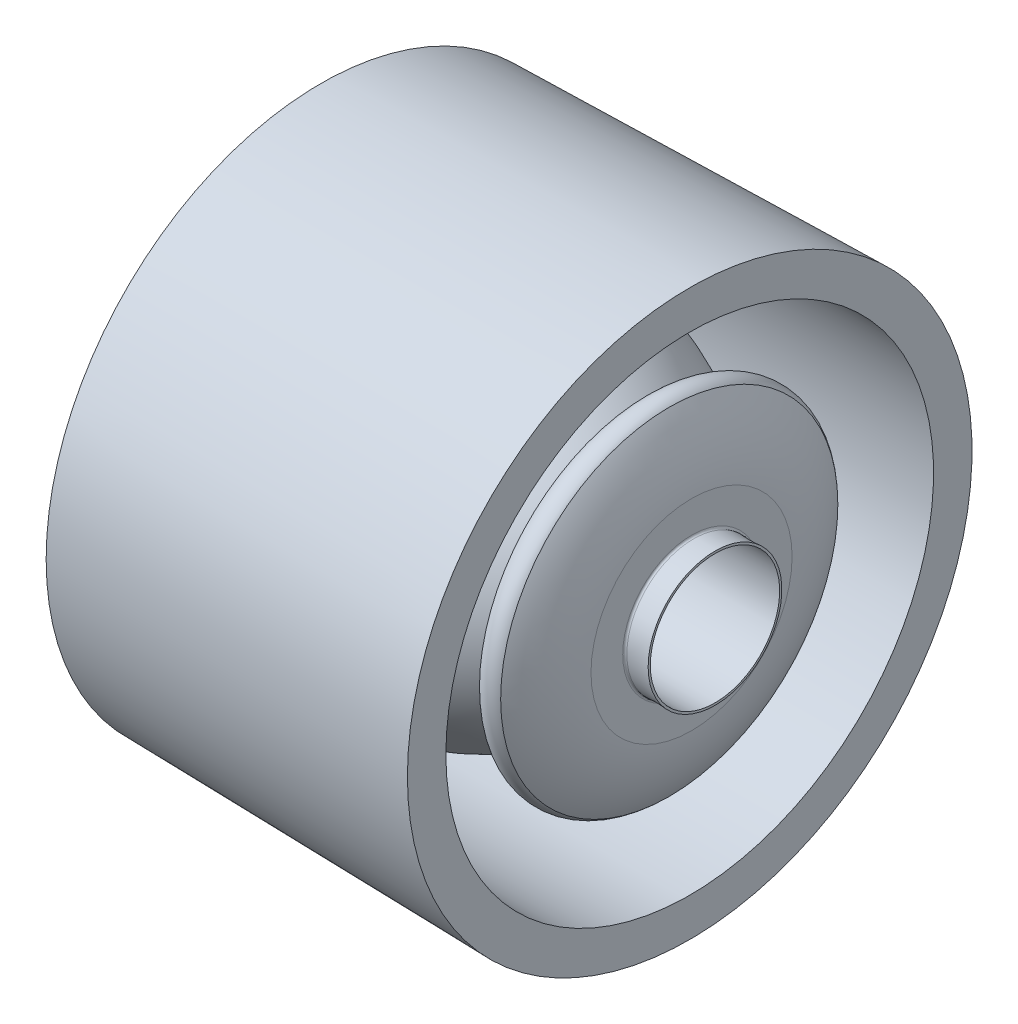
ISO-10303-21;
HEADER;
FILE_DESCRIPTION(('STEP AP214'),'2;1');
FILE_NAME('part.step','',(''),(''),'','','');
FILE_SCHEMA(('AUTOMOTIVE_DESIGN { 1 0 10303 214 1 1 1 1 }'));
ENDSEC;
DATA;
#1=APPLICATION_CONTEXT('core data for automotive mechanical design processes');
#2=APPLICATION_PROTOCOL_DEFINITION('international standard','automotive_design',2000,#1);
#3=PRODUCT_CONTEXT('',#1,'mechanical');
#4=PRODUCT('Part','Part','',(#3));
#5=PRODUCT_RELATED_PRODUCT_CATEGORY('part','',(#4));
#6=PRODUCT_DEFINITION_FORMATION('','',#4);
#7=PRODUCT_DEFINITION_CONTEXT('part definition',#1,'design');
#8=PRODUCT_DEFINITION('design','',#6,#7);
#9=PRODUCT_DEFINITION_SHAPE('','',#8);
#10=(LENGTH_UNIT() NAMED_UNIT(*) SI_UNIT(.MILLI.,.METRE.));
#11=(NAMED_UNIT(*) PLANE_ANGLE_UNIT() SI_UNIT($,.RADIAN.));
#12=(NAMED_UNIT(*) SI_UNIT($,.STERADIAN.) SOLID_ANGLE_UNIT());
#13=UNCERTAINTY_MEASURE_WITH_UNIT(LENGTH_MEASURE(1.E-05),#10,'distance_accuracy_value','');
#14=(GEOMETRIC_REPRESENTATION_CONTEXT(3) GLOBAL_UNCERTAINTY_ASSIGNED_CONTEXT((#13)) GLOBAL_UNIT_ASSIGNED_CONTEXT((#10,
#11,#12)) REPRESENTATION_CONTEXT('',''));
#15=CARTESIAN_POINT('',(0.,0.,0.));
#16=DIRECTION('',(0.,0.,1.));
#17=DIRECTION('',(1.,0.,0.));
#18=AXIS2_PLACEMENT_3D('',#15,#16,#17);
#19=CARTESIAN_POINT('',(39.7171570550938,33.1978,0.));
#20=DIRECTION('',(-1.,0.,0.));
#21=DIRECTION('',(0.,0.,1.));
#22=AXIS2_PLACEMENT_3D('',#19,#20,#21);
#23=TOROIDAL_SURFACE('',#22,18.578805481197,1.50796092577745);
#24=CARTESIAN_POINT('',(40.7646609372587,33.1978,0.));
#25=DIRECTION('',(-1.,0.,0.));
#26=DIRECTION('',(0.,0.,1.));
#27=AXIS2_PLACEMENT_3D('',#24,#25,#26);
#28=CIRCLE('',#27,19.6635551161456);
#29=CARTESIAN_POINT('',(40.7646609372587,33.1978,19.6635551161456));
#30=VERTEX_POINT('',#29);
#31=EDGE_CURVE('E109',#30,#30,#28,.T.);
#32=ORIENTED_EDGE('',*,*,#31,.F.);
#33=EDGE_LOOP('',(#32));
#34=FACE_BOUND('',#33,.T.);
#35=CARTESIAN_POINT('',(38.6508676587122,33.1978,0.));
#36=DIRECTION('',(-1.,0.,0.));
#37=DIRECTION('',(0.,0.,1.));
#38=AXIS2_PLACEMENT_3D('',#35,#36,#37);
#39=CIRCLE('',#38,19.6450948775786);
#40=CARTESIAN_POINT('',(38.6508676587122,33.1978,19.6450948775786));
#41=VERTEX_POINT('',#40);
#42=EDGE_CURVE('E10',#41,#41,#39,.T.);
#43=ORIENTED_EDGE('',*,*,#42,.T.);
#44=EDGE_LOOP('',(#43));
#45=FACE_BOUND('',#44,.T.);
#46=ADVANCED_FACE('F30',(#34,#45),#23,.F.);
#47=CARTESIAN_POINT('',(38.6508676587122,33.1978,0.));
#48=DIRECTION('',(-1.,0.,0.));
#49=DIRECTION('',(0.,0.,1.));
#50=AXIS2_PLACEMENT_3D('',#47,#48,#49);
#51=CONICAL_SURFACE('',#50,19.6450948775786,0.785398163397429);
#52=CARTESIAN_POINT('',(38.4712625362909,33.1978,0.));
#53=DIRECTION('',(-1.,0.,0.));
#54=DIRECTION('',(0.,0.,1.));
#55=AXIS2_PLACEMENT_3D('',#52,#53,#54);
#56=CIRCLE('',#55,19.8247);
#57=CARTESIAN_POINT('',(38.4712625362909,33.1978,19.8247));
#58=VERTEX_POINT('',#57);
#59=EDGE_CURVE('E36',#58,#58,#56,.T.);
#60=ORIENTED_EDGE('',*,*,#59,.T.);
#61=EDGE_LOOP('',(#60));
#62=FACE_BOUND('',#61,.T.);
#63=ORIENTED_EDGE('',*,*,#42,.F.);
#64=EDGE_LOOP('',(#63));
#65=FACE_BOUND('',#64,.T.);
#66=ADVANCED_FACE('F117',(#62,#65),#51,.F.);
#67=CARTESIAN_POINT('',(39.7171570550938,33.1978,0.));
#68=DIRECTION('',(-1.,0.,0.));
#69=DIRECTION('',(0.,0.,1.));
#70=AXIS2_PLACEMENT_3D('',#67,#68,#69);
#71=TOROIDAL_SURFACE('',#70,18.578805481197,1.76196092577746);
#72=CARTESIAN_POINT('',(40.9630515738968,33.1978,0.));
#73=DIRECTION('',(-1.,0.,0.));
#74=DIRECTION('',(0.,0.,1.));
#75=AXIS2_PLACEMENT_3D('',#72,#73,#74);
#76=CIRCLE('',#75,19.8247);
#77=CARTESIAN_POINT('',(40.9630515738968,33.1978,19.8247));
#78=VERTEX_POINT('',#77);
#79=EDGE_CURVE('E40',#78,#78,#76,.T.);
#80=ORIENTED_EDGE('',*,*,#79,.T.);
#81=EDGE_LOOP('',(#80));
#82=FACE_BOUND('',#81,.T.);
#83=ORIENTED_EDGE('',*,*,#59,.F.);
#84=EDGE_LOOP('',(#83));
#85=FACE_BOUND('',#84,.T.);
#86=ADVANCED_FACE('F121',(#82,#85),#71,.T.);
#87=CARTESIAN_POINT('',(26.9169481191962,33.1978,0.));
#88=DIRECTION('',(-1.,0.,0.));
#89=DIRECTION('',(0.,0.,1.));
#90=AXIS2_PLACEMENT_3D('',#87,#88,#89);
#91=DEGENERATE_TOROIDAL_SURFACE('',#90,10.7936458645717,16.6988910127945,.T.);
#92=ORIENTED_EDGE('',*,*,#79,.F.);
#93=EDGE_LOOP('',(#92));
#94=FACE_BOUND('',#93,.T.);
#95=CARTESIAN_POINT('',(43.5840399331653,33.1978,0.));
#96=DIRECTION('',(-1.,0.,0.));
#97=DIRECTION('',(0.,0.,1.));
#98=AXIS2_PLACEMENT_3D('',#95,#96,#97);
#99=CIRCLE('',#98,11.8237);
#100=CARTESIAN_POINT('',(43.5840399331653,33.1978,11.8237));
#101=VERTEX_POINT('',#100);
#102=EDGE_CURVE('E44',#101,#101,#99,.T.);
#103=ORIENTED_EDGE('',*,*,#102,.T.);
#104=EDGE_LOOP('',(#103));
#105=FACE_BOUND('',#104,.T.);
#106=ADVANCED_FACE('F125',(#94,#105),#91,.T.);
#107=CARTESIAN_POINT('',(43.5840399331653,-40.3923492404086,0.));
#108=DIRECTION('',(-1.,0.,0.));
#109=DIRECTION('',(0.,0.,1.));
#110=AXIS2_PLACEMENT_3D('',#107,#108,#109);
#111=PLANE('',#110);
#112=ORIENTED_EDGE('',*,*,#102,.F.);
#113=EDGE_LOOP('',(#112));
#114=FACE_BOUND('',#113,.T.);
#115=CARTESIAN_POINT('',(43.5840399331653,33.1978,0.));
#116=DIRECTION('',(-1.,0.,0.));
#117=DIRECTION('',(0.,0.,1.));
#118=AXIS2_PLACEMENT_3D('',#115,#116,#117);
#119=CIRCLE('',#118,8.09197569485098);
#120=CARTESIAN_POINT('',(43.5840399331653,33.1978,8.09197569485098));
#121=VERTEX_POINT('',#120);
#122=EDGE_CURVE('E49',#121,#121,#119,.T.);
#123=ORIENTED_EDGE('',*,*,#122,.T.);
#124=EDGE_LOOP('',(#123));
#125=FACE_BOUND('',#124,.T.);
#126=ADVANCED_FACE('F132',(#114,#125),#111,.F.);
#127=CARTESIAN_POINT('',(43.8380399331653,33.1978,0.));
#128=DIRECTION('',(-1.,0.,0.));
#129=DIRECTION('',(0.,0.,1.));
#130=AXIS2_PLACEMENT_3D('',#127,#128,#129);
#131=TOROIDAL_SURFACE('',#130,8.09197569485098,0.253999999999998);
#132=CARTESIAN_POINT('',(43.8158993428024,33.1978,0.));
#133=DIRECTION('',(-1.,0.,0.));
#134=DIRECTION('',(0.,0.,1.));
#135=AXIS2_PLACEMENT_3D('',#132,#133,#134);
#136=CIRCLE('',#135,7.83894250679377);
#137=CARTESIAN_POINT('',(43.8158993428024,33.1978,7.83894250679377));
#138=VERTEX_POINT('',#137);
#139=EDGE_CURVE('E52',#138,#138,#136,.T.);
#140=ORIENTED_EDGE('',*,*,#139,.T.);
#141=EDGE_LOOP('',(#140));
#142=FACE_BOUND('',#141,.T.);
#143=ORIENTED_EDGE('',*,*,#122,.F.);
#144=EDGE_LOOP('',(#143));
#145=FACE_BOUND('',#144,.T.);
#146=ADVANCED_FACE('F136',(#142,#145),#131,.F.);
#147=CARTESIAN_POINT('',(44.9628881535825,33.1978,0.));
#148=DIRECTION('',(-1.,0.,0.));
#149=DIRECTION('',(0.,0.,1.));
#150=AXIS2_PLACEMENT_3D('',#147,#148,#149);
#151=TOROIDAL_SURFACE('',#150,20.9472756949032,13.158418685486);
#152=CARTESIAN_POINT('',(46.3417363739985,33.1978,0.));
#153=DIRECTION('',(-1.,0.,0.));
#154=DIRECTION('',(0.,0.,1.));
#155=AXIS2_PLACEMENT_3D('',#152,#153,#154);
#156=CIRCLE('',#155,7.8612999999998);
#157=CARTESIAN_POINT('',(46.3417363739985,33.1978,7.8612999999998));
#158=VERTEX_POINT('',#157);
#159=EDGE_CURVE('E55',#158,#158,#156,.T.);
#160=ORIENTED_EDGE('',*,*,#159,.T.);
#161=EDGE_LOOP('',(#160));
#162=FACE_BOUND('',#161,.T.);
#163=ORIENTED_EDGE('',*,*,#139,.F.);
#164=EDGE_LOOP('',(#163));
#165=FACE_BOUND('',#164,.T.);
#166=ADVANCED_FACE('F140',(#162,#165),#151,.F.);
#167=CARTESIAN_POINT('',(46.3417363739985,-40.3923492404094,0.));
#168=DIRECTION('',(-1.,0.,0.));
#169=DIRECTION('',(0.,0.,1.));
#170=AXIS2_PLACEMENT_3D('',#167,#168,#169);
#171=PLANE('',#170);
#172=ORIENTED_EDGE('',*,*,#159,.F.);
#173=EDGE_LOOP('',(#172));
#174=FACE_BOUND('',#173,.T.);
#175=CARTESIAN_POINT('',(46.3417363739985,33.1978,0.));
#176=DIRECTION('',(-1.,0.,0.));
#177=DIRECTION('',(0.,0.,1.));
#178=AXIS2_PLACEMENT_3D('',#175,#176,#177);
#179=CIRCLE('',#178,7.6072999999998);
#180=CARTESIAN_POINT('',(46.3417363739985,33.1978,7.6072999999998));
#181=VERTEX_POINT('',#180);
#182=EDGE_CURVE('E58',#181,#181,#179,.T.);
#183=ORIENTED_EDGE('',*,*,#182,.T.);
#184=EDGE_LOOP('',(#183));
#185=FACE_BOUND('',#184,.T.);
#186=ADVANCED_FACE('F144',(#174,#185),#171,.F.);
#187=CARTESIAN_POINT('',(10.414,33.1978,0.));
#188=DIRECTION('',(-1.,0.,0.));
#189=DIRECTION('',(0.,0.,1.));
#190=AXIS2_PLACEMENT_3D('',#187,#188,#189);
#191=CYLINDRICAL_SURFACE('',#190,7.60729999999981);
#192=ORIENTED_EDGE('',*,*,#182,.F.);
#193=EDGE_LOOP('',(#192));
#194=FACE_BOUND('',#193,.T.);
#195=CARTESIAN_POINT('',(34.7847363739985,33.1978,0.));
#196=DIRECTION('',(-1.,0.,0.));
#197=DIRECTION('',(0.,0.,1.));
#198=AXIS2_PLACEMENT_3D('',#195,#196,#197);
#199=CIRCLE('',#198,7.60729999999982);
#200=CARTESIAN_POINT('',(34.7847363739985,33.1978,7.60729999999982));
#201=VERTEX_POINT('',#200);
#202=EDGE_CURVE('E61',#201,#201,#199,.T.);
#203=ORIENTED_EDGE('',*,*,#202,.T.);
#204=EDGE_LOOP('',(#203));
#205=FACE_BOUND('',#204,.T.);
#206=ADVANCED_FACE('F148',(#194,#205),#191,.F.);
#207=CARTESIAN_POINT('',(34.7847363739985,-40.3923492404086,0.));
#208=DIRECTION('',(-1.,0.,0.));
#209=DIRECTION('',(0.,0.,1.));
#210=AXIS2_PLACEMENT_3D('',#207,#208,#209);
#211=PLANE('',#210);
#212=CARTESIAN_POINT('',(34.7847363739985,33.1978,0.));
#213=DIRECTION('',(-1.,0.,0.));
#214=DIRECTION('',(0.,0.,1.));
#215=AXIS2_PLACEMENT_3D('',#212,#213,#214);
#216=CIRCLE('',#215,7.86129999999999);
#217=CARTESIAN_POINT('',(34.7847363739985,33.1978,7.86129999999999));
#218=VERTEX_POINT('',#217);
#219=EDGE_CURVE('E64',#218,#218,#216,.T.);
#220=ORIENTED_EDGE('',*,*,#219,.T.);
#221=EDGE_LOOP('',(#220));
#222=FACE_BOUND('',#221,.T.);
#223=ORIENTED_EDGE('',*,*,#202,.F.);
#224=EDGE_LOOP('',(#223));
#225=FACE_BOUND('',#224,.T.);
#226=ADVANCED_FACE('F152',(#222,#225),#211,.T.);
#227=CARTESIAN_POINT('',(10.414,33.1978,0.));
#228=DIRECTION('',(-1.,0.,0.));
#229=DIRECTION('',(0.,0.,1.));
#230=AXIS2_PLACEMENT_3D('',#227,#228,#229);
#231=CYLINDRICAL_SURFACE('',#230,7.86129999999999);
#232=CARTESIAN_POINT('',(42.8572193305396,33.1978,0.));
#233=DIRECTION('',(-1.,0.,0.));
#234=DIRECTION('',(0.,0.,1.));
#235=AXIS2_PLACEMENT_3D('',#232,#233,#234);
#236=CIRCLE('',#235,7.86129999999999);
#237=CARTESIAN_POINT('',(42.8572193305396,33.1978,7.86129999999999));
#238=VERTEX_POINT('',#237);
#239=EDGE_CURVE('E67',#238,#238,#236,.T.);
#240=ORIENTED_EDGE('',*,*,#239,.T.);
#241=EDGE_LOOP('',(#240));
#242=FACE_BOUND('',#241,.T.);
#243=ORIENTED_EDGE('',*,*,#219,.F.);
#244=EDGE_LOOP('',(#243));
#245=FACE_BOUND('',#244,.T.);
#246=ADVANCED_FACE('F156',(#242,#245),#231,.T.);
#247=CARTESIAN_POINT('',(12.8815266953126,33.1978,0.));
#248=DIRECTION('',(-1.,0.,0.));
#249=DIRECTION('',(0.,0.,1.));
#250=AXIS2_PLACEMENT_3D('',#247,#248,#249);
#251=DEGENERATE_TOROIDAL_SURFACE('',#250,15.2894545867104,37.874788275259,.F.);
#252=ORIENTED_EDGE('',*,*,#239,.F.);
#253=EDGE_LOOP('',(#252));
#254=FACE_BOUND('',#253,.T.);
#255=CARTESIAN_POINT('',(11.3709949650023,33.1978,0.));
#256=DIRECTION('',(-1.,0.,0.));
#257=DIRECTION('',(0.,0.,1.));
#258=AXIS2_PLACEMENT_3D('',#255,#256,#257);
#259=CIRCLE('',#258,22.5552);
#260=CARTESIAN_POINT('',(11.3709949650023,33.1978,22.5552));
#261=VERTEX_POINT('',#260);
#262=EDGE_CURVE('E70',#261,#261,#259,.T.);
#263=ORIENTED_EDGE('',*,*,#262,.T.);
#264=EDGE_LOOP('',(#263));
#265=FACE_BOUND('',#264,.T.);
#266=ADVANCED_FACE('F160',(#254,#265),#251,.T.);
#267=CARTESIAN_POINT('',(10.414,33.1978,0.));
#268=DIRECTION('',(-1.,0.,0.));
#269=DIRECTION('',(0.,0.,1.));
#270=AXIS2_PLACEMENT_3D('',#267,#268,#269);
#271=CYLINDRICAL_SURFACE('',#270,22.5552);
#272=ORIENTED_EDGE('',*,*,#262,.F.);
#273=EDGE_LOOP('',(#272));
#274=FACE_BOUND('',#273,.T.);
#275=CARTESIAN_POINT('',(10.7189529785927,33.1978,0.));
#276=DIRECTION('',(-1.,0.,0.));
#277=DIRECTION('',(0.,0.,1.));
#278=AXIS2_PLACEMENT_3D('',#275,#276,#277);
#279=CIRCLE('',#278,22.5552);
#280=CARTESIAN_POINT('',(10.7189529785927,33.1978,22.5552));
#281=VERTEX_POINT('',#280);
#282=EDGE_CURVE('E73',#281,#281,#279,.T.);
#283=ORIENTED_EDGE('',*,*,#282,.T.);
#284=EDGE_LOOP('',(#283));
#285=FACE_BOUND('',#284,.T.);
#286=ADVANCED_FACE('F164',(#274,#285),#271,.F.);
#287=CARTESIAN_POINT('',(10.7189529785927,-40.3923492404086,0.));
#288=DIRECTION('',(1.,0.,0.));
#289=DIRECTION('',(0.,0.,-1.));
#290=AXIS2_PLACEMENT_3D('',#287,#288,#289);
#291=PLANE('',#290);
#292=ORIENTED_EDGE('',*,*,#282,.F.);
#293=EDGE_LOOP('',(#292));
#294=FACE_BOUND('',#293,.T.);
#295=ADVANCED_FACE('F168',(#294),#291,.T.);
#296=CARTESIAN_POINT('',(10.414,-40.3923492404086,0.));
#297=DIRECTION('',(1.,0.,0.));
#298=DIRECTION('',(0.,0.,-1.));
#299=AXIS2_PLACEMENT_3D('',#296,#297,#298);
#300=PLANE('',#299);
#301=CARTESIAN_POINT('',(10.414,33.1978,0.));
#302=DIRECTION('',(-1.,0.,0.));
#303=DIRECTION('',(0.,0.,1.));
#304=AXIS2_PLACEMENT_3D('',#301,#302,#303);
#305=CIRCLE('',#304,22.8092);
#306=CARTESIAN_POINT('',(10.414,33.1978,22.8092));
#307=VERTEX_POINT('',#306);
#308=EDGE_CURVE('E76',#307,#307,#305,.T.);
#309=ORIENTED_EDGE('',*,*,#308,.T.);
#310=EDGE_LOOP('',(#309));
#311=FACE_BOUND('',#310,.T.);
#312=ADVANCED_FACE('F172',(#311),#300,.F.);
#313=CARTESIAN_POINT('',(0.,33.1978,0.));
#314=DIRECTION('',(-1.,0.,0.));
#315=DIRECTION('',(0.,0.,1.));
#316=AXIS2_PLACEMENT_3D('',#313,#314,#315);
#317=CONICAL_SURFACE('',#316,26.7208,0.35930514376324);
#318=ORIENTED_EDGE('',*,*,#308,.F.);
#319=EDGE_LOOP('',(#318));
#320=FACE_BOUND('',#319,.T.);
#321=CARTESIAN_POINT('',(0.,33.1978,0.));
#322=DIRECTION('',(-1.,0.,0.));
#323=DIRECTION('',(0.,0.,1.));
#324=AXIS2_PLACEMENT_3D('',#321,#322,#323);
#325=CIRCLE('',#324,26.7208);
#326=CARTESIAN_POINT('',(0.,33.1978,26.7208));
#327=VERTEX_POINT('',#326);
#328=EDGE_CURVE('E79',#327,#327,#325,.T.);
#329=ORIENTED_EDGE('',*,*,#328,.T.);
#330=EDGE_LOOP('',(#329));
#331=FACE_BOUND('',#330,.T.);
#332=ADVANCED_FACE('F176',(#320,#331),#317,.F.);
#333=CARTESIAN_POINT('',(0.,-40.3923492404086,0.));
#334=DIRECTION('',(1.,0.,0.));
#335=DIRECTION('',(0.,0.,-1.));
#336=AXIS2_PLACEMENT_3D('',#333,#334,#335);
#337=PLANE('',#336);
#338=ORIENTED_EDGE('',*,*,#328,.F.);
#339=EDGE_LOOP('',(#338));
#340=FACE_BOUND('',#339,.T.);
#341=CARTESIAN_POINT('',(0.,33.1978,0.));
#342=DIRECTION('',(-1.,0.,0.));
#343=DIRECTION('',(0.,0.,1.));
#344=AXIS2_PLACEMENT_3D('',#341,#342,#343);
#345=CIRCLE('',#344,32.3088);
#346=CARTESIAN_POINT('',(0.,33.1978,32.3088));
#347=VERTEX_POINT('',#346);
#348=EDGE_CURVE('E82',#347,#347,#345,.T.);
#349=ORIENTED_EDGE('',*,*,#348,.T.);
#350=EDGE_LOOP('',(#349));
#351=FACE_BOUND('',#350,.T.);
#352=ADVANCED_FACE('F180',(#340,#351),#337,.F.);
#353=CARTESIAN_POINT('',(0.,33.1978,0.));
#354=DIRECTION('',(1.,0.,0.));
#355=DIRECTION('',(0.,0.,-1.));
#356=AXIS2_PLACEMENT_3D('',#353,#354,#355);
#357=CONICAL_SURFACE('',#356,32.3088,0.0204952000177477);
#358=CARTESIAN_POINT('',(43.369936374,33.1978,0.));
#359=DIRECTION('',(-1.,0.,0.));
#360=DIRECTION('',(0.,0.,1.));
#361=AXIS2_PLACEMENT_3D('',#358,#359,#360);
#362=CIRCLE('',#361,33.1978);
#363=CARTESIAN_POINT('',(43.369936374,33.1978,33.1978));
#364=VERTEX_POINT('',#363);
#365=EDGE_CURVE('E85',#364,#364,#362,.T.);
#366=ORIENTED_EDGE('',*,*,#365,.T.);
#367=EDGE_LOOP('',(#366));
#368=FACE_BOUND('',#367,.T.);
#369=ORIENTED_EDGE('',*,*,#348,.F.);
#370=EDGE_LOOP('',(#369));
#371=FACE_BOUND('',#370,.T.);
#372=ADVANCED_FACE('F184',(#368,#371),#357,.T.);
#373=CARTESIAN_POINT('',(43.369936374,-40.3923492404086,0.));
#374=DIRECTION('',(1.,0.,0.));
#375=DIRECTION('',(0.,0.,-1.));
#376=AXIS2_PLACEMENT_3D('',#373,#374,#375);
#377=PLANE('',#376);
#378=CARTESIAN_POINT('',(43.369936374,33.1978,0.));
#379=DIRECTION('',(-1.,0.,0.));
#380=DIRECTION('',(0.,0.,1.));
#381=AXIS2_PLACEMENT_3D('',#378,#379,#380);
#382=CIRCLE('',#381,28.6766);
#383=CARTESIAN_POINT('',(43.369936374,33.1978,28.6766));
#384=VERTEX_POINT('',#383);
#385=EDGE_CURVE('E88',#384,#384,#382,.T.);
#386=ORIENTED_EDGE('',*,*,#385,.T.);
#387=EDGE_LOOP('',(#386));
#388=FACE_BOUND('',#387,.T.);
#389=ORIENTED_EDGE('',*,*,#365,.F.);
#390=EDGE_LOOP('',(#389));
#391=FACE_BOUND('',#390,.T.);
#392=ADVANCED_FACE('F188',(#388,#391),#377,.T.);
#393=CARTESIAN_POINT('',(10.414,33.1978,0.));
#394=DIRECTION('',(-1.,0.,0.));
#395=DIRECTION('',(0.,0.,1.));
#396=AXIS2_PLACEMENT_3D('',#393,#394,#395);
#397=CYLINDRICAL_SURFACE('',#396,28.6766);
#398=CARTESIAN_POINT('',(11.365936374,33.1978,0.));
#399=DIRECTION('',(-1.,0.,0.));
#400=DIRECTION('',(0.,0.,1.));
#401=AXIS2_PLACEMENT_3D('',#398,#399,#400);
#402=CIRCLE('',#401,28.6766);
#403=CARTESIAN_POINT('',(11.365936374,33.1978,28.6766));
#404=VERTEX_POINT('',#403);
#405=EDGE_CURVE('E91',#404,#404,#402,.T.);
#406=ORIENTED_EDGE('',*,*,#405,.T.);
#407=EDGE_LOOP('',(#406));
#408=FACE_BOUND('',#407,.T.);
#409=ORIENTED_EDGE('',*,*,#385,.F.);
#410=EDGE_LOOP('',(#409));
#411=FACE_BOUND('',#410,.T.);
#412=ADVANCED_FACE('F192',(#408,#411),#397,.F.);
#413=CARTESIAN_POINT('',(11.365936374,-40.3923492404086,0.));
#414=DIRECTION('',(-1.,0.,0.));
#415=DIRECTION('',(0.,0.,1.));
#416=AXIS2_PLACEMENT_3D('',#413,#414,#415);
#417=PLANE('',#416);
#418=ORIENTED_EDGE('',*,*,#405,.F.);
#419=EDGE_LOOP('',(#418));
#420=FACE_BOUND('',#419,.T.);
#421=CARTESIAN_POINT('',(11.365936374,33.1978,0.));
#422=DIRECTION('',(-1.,0.,0.));
#423=DIRECTION('',(0.,0.,1.));
#424=AXIS2_PLACEMENT_3D('',#421,#422,#423);
#425=CIRCLE('',#424,22.8092);
#426=CARTESIAN_POINT('',(11.365936374,33.1978,22.8092));
#427=VERTEX_POINT('',#426);
#428=EDGE_CURVE('E94',#427,#427,#425,.T.);
#429=ORIENTED_EDGE('',*,*,#428,.T.);
#430=EDGE_LOOP('',(#429));
#431=FACE_BOUND('',#430,.T.);
#432=ADVANCED_FACE('F196',(#420,#431),#417,.F.);
#433=CARTESIAN_POINT('',(12.8815266953126,33.1978,0.));
#434=DIRECTION('',(-1.,0.,0.));
#435=DIRECTION('',(0.,0.,1.));
#436=AXIS2_PLACEMENT_3D('',#433,#434,#435);
#437=DEGENERATE_TOROIDAL_SURFACE('',#436,15.2894545867104,38.1287882752589,.F.);
#438=CARTESIAN_POINT('',(43.0972539989697,33.1978,0.));
#439=DIRECTION('',(-1.,0.,0.));
#440=DIRECTION('',(0.,0.,1.));
#441=AXIS2_PLACEMENT_3D('',#438,#439,#440);
#442=CIRCLE('',#441,7.96596024189573);
#443=CARTESIAN_POINT('',(43.0972539989697,33.1978,7.96596024189573));
#444=VERTEX_POINT('',#443);
#445=EDGE_CURVE('E97',#444,#444,#442,.T.);
#446=ORIENTED_EDGE('',*,*,#445,.T.);
#447=EDGE_LOOP('',(#446));
#448=FACE_BOUND('',#447,.T.);
#449=ORIENTED_EDGE('',*,*,#428,.F.);
#450=EDGE_LOOP('',(#449));
#451=FACE_BOUND('',#450,.T.);
#452=ADVANCED_FACE('F200',(#448,#451),#437,.F.);
#453=CARTESIAN_POINT('',(43.0972539989697,33.1978,0.));
#454=DIRECTION('',(-1.,0.,0.));
#455=DIRECTION('',(0.,0.,1.));
#456=AXIS2_PLACEMENT_3D('',#453,#454,#455);
#457=CONICAL_SURFACE('',#456,7.96596024189573,0.914839858644753);
#458=CARTESIAN_POINT('',(43.1778053395642,33.1978,0.));
#459=DIRECTION('',(-1.,0.,0.));
#460=DIRECTION('',(0.,0.,1.));
#461=AXIS2_PLACEMENT_3D('',#458,#459,#460);
#462=CIRCLE('',#461,7.8613);
#463=CARTESIAN_POINT('',(43.1778053395642,33.1978,7.8613));
#464=VERTEX_POINT('',#463);
#465=EDGE_CURVE('E100',#464,#464,#462,.T.);
#466=ORIENTED_EDGE('',*,*,#465,.T.);
#467=EDGE_LOOP('',(#466));
#468=FACE_BOUND('',#467,.T.);
#469=ORIENTED_EDGE('',*,*,#445,.F.);
#470=EDGE_LOOP('',(#469));
#471=FACE_BOUND('',#470,.T.);
#472=ADVANCED_FACE('F204',(#468,#471),#457,.T.);
#473=CARTESIAN_POINT('',(10.414,33.1978,0.));
#474=DIRECTION('',(-1.,0.,0.));
#475=DIRECTION('',(0.,0.,1.));
#476=AXIS2_PLACEMENT_3D('',#473,#474,#475);
#477=CYLINDRICAL_SURFACE('',#476,7.8613);
#478=CARTESIAN_POINT('',(43.3300399331653,33.1978,0.));
#479=DIRECTION('',(-1.,0.,0.));
#480=DIRECTION('',(0.,0.,1.));
#481=AXIS2_PLACEMENT_3D('',#478,#479,#480);
#482=CIRCLE('',#481,7.8613);
#483=CARTESIAN_POINT('',(43.3300399331653,33.1978,7.8613));
#484=VERTEX_POINT('',#483);
#485=EDGE_CURVE('E103',#484,#484,#482,.T.);
#486=ORIENTED_EDGE('',*,*,#485,.T.);
#487=EDGE_LOOP('',(#486));
#488=FACE_BOUND('',#487,.T.);
#489=ORIENTED_EDGE('',*,*,#465,.F.);
#490=EDGE_LOOP('',(#489));
#491=FACE_BOUND('',#490,.T.);
#492=ADVANCED_FACE('F208',(#488,#491),#477,.T.);
#493=CARTESIAN_POINT('',(43.3300399331653,-40.3923492404086,0.));
#494=DIRECTION('',(-1.,0.,0.));
#495=DIRECTION('',(0.,0.,1.));
#496=AXIS2_PLACEMENT_3D('',#493,#494,#495);
#497=PLANE('',#496);
#498=CARTESIAN_POINT('',(43.3300399331653,33.1978,0.));
#499=DIRECTION('',(-1.,0.,0.));
#500=DIRECTION('',(0.,0.,1.));
#501=AXIS2_PLACEMENT_3D('',#498,#499,#500);
#502=CIRCLE('',#501,11.8158285923213);
#503=CARTESIAN_POINT('',(43.3300399331653,33.1978,11.8158285923213));
#504=VERTEX_POINT('',#503);
#505=EDGE_CURVE('E106',#504,#504,#502,.T.);
#506=ORIENTED_EDGE('',*,*,#505,.T.);
#507=EDGE_LOOP('',(#506));
#508=FACE_BOUND('',#507,.T.);
#509=ORIENTED_EDGE('',*,*,#485,.F.);
#510=EDGE_LOOP('',(#509));
#511=FACE_BOUND('',#510,.T.);
#512=ADVANCED_FACE('F212',(#508,#511),#497,.T.);
#513=CARTESIAN_POINT('',(26.9169481191962,33.1978,0.));
#514=DIRECTION('',(-1.,0.,0.));
#515=DIRECTION('',(0.,0.,1.));
#516=AXIS2_PLACEMENT_3D('',#513,#514,#515);
#517=DEGENERATE_TOROIDAL_SURFACE('',#516,10.7936458645717,16.4448910127945,.T.);
#518=ORIENTED_EDGE('',*,*,#31,.T.);
#519=EDGE_LOOP('',(#518));
#520=FACE_BOUND('',#519,.T.);
#521=ORIENTED_EDGE('',*,*,#505,.F.);
#522=EDGE_LOOP('',(#521));
#523=FACE_BOUND('',#522,.T.);
#524=ADVANCED_FACE('F113',(#520,#523),#517,.F.);
#525=CLOSED_SHELL('',(#46,#66,#86,#106,#126,#146,#166,#186,#206,#226,#246,#266,#286,#295,#312,
#332,#352,#372,#392,#412,#432,#452,#472,#492,#512,#524));
#526=MANIFOLD_SOLID_BREP('B2',#525);
#527=ADVANCED_BREP_SHAPE_REPRESENTATION('',(#18,#526),#14);
#528=SHAPE_DEFINITION_REPRESENTATION(#9,#527);
ENDSEC;
END-ISO-10303-21;
